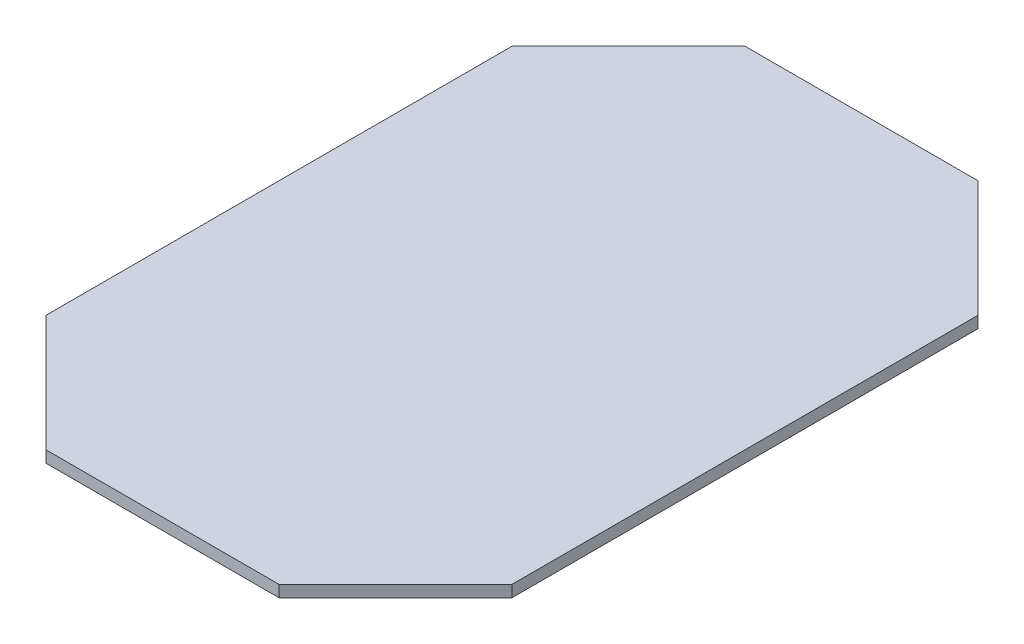
ISO-10303-21;
HEADER;
FILE_DESCRIPTION(('STEP AP214'),'2;1');
FILE_NAME('part.step','',(''),(''),'','','');
FILE_SCHEMA(('AUTOMOTIVE_DESIGN { 1 0 10303 214 1 1 1 1 }'));
ENDSEC;
DATA;
#1=APPLICATION_CONTEXT('core data for automotive mechanical design processes');
#2=APPLICATION_PROTOCOL_DEFINITION('international standard','automotive_design',2000,#1);
#3=PRODUCT_CONTEXT('',#1,'mechanical');
#4=PRODUCT('Part','Part','',(#3));
#5=PRODUCT_RELATED_PRODUCT_CATEGORY('part','',(#4));
#6=PRODUCT_DEFINITION_FORMATION('','',#4);
#7=PRODUCT_DEFINITION_CONTEXT('part definition',#1,'design');
#8=PRODUCT_DEFINITION('design','',#6,#7);
#9=PRODUCT_DEFINITION_SHAPE('','',#8);
#10=(LENGTH_UNIT() NAMED_UNIT(*) SI_UNIT(.MILLI.,.METRE.));
#11=(NAMED_UNIT(*) PLANE_ANGLE_UNIT() SI_UNIT($,.RADIAN.));
#12=(NAMED_UNIT(*) SI_UNIT($,.STERADIAN.) SOLID_ANGLE_UNIT());
#13=UNCERTAINTY_MEASURE_WITH_UNIT(LENGTH_MEASURE(1.E-05),#10,'distance_accuracy_value','');
#14=(GEOMETRIC_REPRESENTATION_CONTEXT(3) GLOBAL_UNCERTAINTY_ASSIGNED_CONTEXT((#13)) GLOBAL_UNIT_ASSIGNED_CONTEXT((#10,
#11,#12)) REPRESENTATION_CONTEXT('',''));
#15=CARTESIAN_POINT('',(0.,0.,0.));
#16=DIRECTION('',(0.,0.,1.));
#17=DIRECTION('',(1.,0.,0.));
#18=AXIS2_PLACEMENT_3D('',#15,#16,#17);
#19=CARTESIAN_POINT('',(40.,2.,0.));
#20=DIRECTION('',(1.,0.,0.));
#21=DIRECTION('',(0.,0.,-1.));
#22=AXIS2_PLACEMENT_3D('',#19,#20,#21);
#23=PLANE('',#22);
#24=DIRECTION('',(0.,0.,1.));
#25=VECTOR('',#24,1.);
#26=CARTESIAN_POINT('',(40.,0.,0.));
#27=LINE('',#26,#25);
#28=CARTESIAN_POINT('',(40.,0.,-40.));
#29=VERTEX_POINT('',#28);
#30=CARTESIAN_POINT('',(40.,0.,40.));
#31=VERTEX_POINT('',#30);
#32=EDGE_CURVE('E143',#29,#31,#27,.T.);
#33=ORIENTED_EDGE('',*,*,#32,.F.);
#34=DIRECTION('',(0.,-1.,0.));
#35=VECTOR('',#34,1.);
#36=CARTESIAN_POINT('',(40.,2.,-40.));
#37=LINE('',#36,#35);
#38=CARTESIAN_POINT('',(40.,2.,-40.));
#39=VERTEX_POINT('',#38);
#40=EDGE_CURVE('E11',#39,#29,#37,.T.);
#41=ORIENTED_EDGE('',*,*,#40,.F.);
#42=DIRECTION('',(0.,0.,1.));
#43=VECTOR('',#42,1.);
#44=CARTESIAN_POINT('',(40.,2.,0.));
#45=LINE('',#44,#43);
#46=CARTESIAN_POINT('',(40.,2.,40.));
#47=VERTEX_POINT('',#46);
#48=EDGE_CURVE('E169',#39,#47,#45,.T.);
#49=ORIENTED_EDGE('',*,*,#48,.T.);
#50=DIRECTION('',(0.,-1.,0.));
#51=VECTOR('',#50,1.);
#52=CARTESIAN_POINT('',(40.,2.,40.));
#53=LINE('',#52,#51);
#54=EDGE_CURVE('E97',#47,#31,#53,.T.);
#55=ORIENTED_EDGE('',*,*,#54,.T.);
#56=EDGE_LOOP('',(#33,#41,#49,#55));
#57=FACE_BOUND('',#56,.T.);
#58=ADVANCED_FACE('F45',(#57),#23,.T.);
#59=CARTESIAN_POINT('',(40.,2.,-40.));
#60=DIRECTION('',(0.707106781186547,0.,-0.707106781186547));
#61=DIRECTION('',(-0.707106781186548,0.,-0.707106781186548));
#62=AXIS2_PLACEMENT_3D('',#59,#60,#61);
#63=PLANE('',#62);
#64=DIRECTION('',(0.707106781186548,0.,0.707106781186548));
#65=VECTOR('',#64,1.);
#66=CARTESIAN_POINT('',(40.,0.,-40.));
#67=LINE('',#66,#65);
#68=CARTESIAN_POINT('',(20.,0.,-60.));
#69=VERTEX_POINT('',#68);
#70=EDGE_CURVE('E147',#69,#29,#67,.T.);
#71=ORIENTED_EDGE('',*,*,#70,.F.);
#72=DIRECTION('',(0.,-1.,0.));
#73=VECTOR('',#72,1.);
#74=CARTESIAN_POINT('',(20.,2.,-60.));
#75=LINE('',#74,#73);
#76=CARTESIAN_POINT('',(20.,2.,-60.));
#77=VERTEX_POINT('',#76);
#78=EDGE_CURVE('E54',#77,#69,#75,.T.);
#79=ORIENTED_EDGE('',*,*,#78,.F.);
#80=DIRECTION('',(0.707106781186548,0.,0.707106781186548));
#81=VECTOR('',#80,1.);
#82=CARTESIAN_POINT('',(40.,2.,-40.));
#83=LINE('',#82,#81);
#84=EDGE_CURVE('E201',#77,#39,#83,.T.);
#85=ORIENTED_EDGE('',*,*,#84,.T.);
#86=ORIENTED_EDGE('',*,*,#40,.T.);
#87=EDGE_LOOP('',(#71,#79,#85,#86));
#88=FACE_BOUND('',#87,.T.);
#89=ADVANCED_FACE('F192',(#88),#63,.T.);
#90=CARTESIAN_POINT('',(0.,2.,-60.));
#91=DIRECTION('',(0.,0.,-1.));
#92=DIRECTION('',(-1.,0.,0.));
#93=AXIS2_PLACEMENT_3D('',#90,#91,#92);
#94=PLANE('',#93);
#95=DIRECTION('',(1.,0.,0.));
#96=VECTOR('',#95,1.);
#97=CARTESIAN_POINT('',(0.,0.,-60.));
#98=LINE('',#97,#96);
#99=CARTESIAN_POINT('',(-20.,0.,-60.));
#100=VERTEX_POINT('',#99);
#101=EDGE_CURVE('E151',#100,#69,#98,.T.);
#102=ORIENTED_EDGE('',*,*,#101,.F.);
#103=DIRECTION('',(0.,-1.,0.));
#104=VECTOR('',#103,1.);
#105=CARTESIAN_POINT('',(-20.,2.,-60.));
#106=LINE('',#105,#104);
#107=CARTESIAN_POINT('',(-20.,2.,-60.));
#108=VERTEX_POINT('',#107);
#109=EDGE_CURVE('E179',#108,#100,#106,.T.);
#110=ORIENTED_EDGE('',*,*,#109,.F.);
#111=DIRECTION('',(1.,0.,0.));
#112=VECTOR('',#111,1.);
#113=CARTESIAN_POINT('',(0.,2.,-60.));
#114=LINE('',#113,#112);
#115=EDGE_CURVE('E188',#108,#77,#114,.T.);
#116=ORIENTED_EDGE('',*,*,#115,.T.);
#117=ORIENTED_EDGE('',*,*,#78,.T.);
#118=EDGE_LOOP('',(#102,#110,#116,#117));
#119=FACE_BOUND('',#118,.T.);
#120=ADVANCED_FACE('F186',(#119),#94,.T.);
#121=CARTESIAN_POINT('',(-40.,2.,-40.));
#122=DIRECTION('',(-0.707106781186547,0.,-0.707106781186547));
#123=DIRECTION('',(-0.707106781186548,0.,0.707106781186548));
#124=AXIS2_PLACEMENT_3D('',#121,#122,#123);
#125=PLANE('',#124);
#126=DIRECTION('',(0.707106781186548,0.,-0.707106781186548));
#127=VECTOR('',#126,1.);
#128=CARTESIAN_POINT('',(-40.,0.,-40.));
#129=LINE('',#128,#127);
#130=CARTESIAN_POINT('',(-40.,0.,-40.));
#131=VERTEX_POINT('',#130);
#132=EDGE_CURVE('E155',#131,#100,#129,.T.);
#133=ORIENTED_EDGE('',*,*,#132,.F.);
#134=DIRECTION('',(0.,-1.,0.));
#135=VECTOR('',#134,1.);
#136=CARTESIAN_POINT('',(-40.,2.,-40.));
#137=LINE('',#136,#135);
#138=CARTESIAN_POINT('',(-40.,2.,-40.));
#139=VERTEX_POINT('',#138);
#140=EDGE_CURVE('E176',#139,#131,#137,.T.);
#141=ORIENTED_EDGE('',*,*,#140,.F.);
#142=DIRECTION('',(0.707106781186548,0.,-0.707106781186548));
#143=VECTOR('',#142,1.);
#144=CARTESIAN_POINT('',(-40.,2.,-40.));
#145=LINE('',#144,#143);
#146=EDGE_CURVE('E200',#139,#108,#145,.T.);
#147=ORIENTED_EDGE('',*,*,#146,.T.);
#148=ORIENTED_EDGE('',*,*,#109,.T.);
#149=EDGE_LOOP('',(#133,#141,#147,#148));
#150=FACE_BOUND('',#149,.T.);
#151=ADVANCED_FACE('F198',(#150),#125,.T.);
#152=CARTESIAN_POINT('',(-40.,2.,0.));
#153=DIRECTION('',(1.,0.,0.));
#154=DIRECTION('',(0.,0.,-1.));
#155=AXIS2_PLACEMENT_3D('',#152,#153,#154);
#156=PLANE('',#155);
#157=DIRECTION('',(0.,0.,1.));
#158=VECTOR('',#157,1.);
#159=CARTESIAN_POINT('',(-40.,0.,0.));
#160=LINE('',#159,#158);
#161=CARTESIAN_POINT('',(-40.,0.,40.));
#162=VERTEX_POINT('',#161);
#163=EDGE_CURVE('E159',#131,#162,#160,.T.);
#164=ORIENTED_EDGE('',*,*,#163,.T.);
#165=DIRECTION('',(0.,-1.,0.));
#166=VECTOR('',#165,1.);
#167=CARTESIAN_POINT('',(-40.,2.,40.));
#168=LINE('',#167,#166);
#169=CARTESIAN_POINT('',(-40.,2.,40.));
#170=VERTEX_POINT('',#169);
#171=EDGE_CURVE('E133',#170,#162,#168,.T.);
#172=ORIENTED_EDGE('',*,*,#171,.F.);
#173=DIRECTION('',(0.,0.,1.));
#174=VECTOR('',#173,1.);
#175=CARTESIAN_POINT('',(-40.,2.,0.));
#176=LINE('',#175,#174);
#177=EDGE_CURVE('E122',#139,#170,#176,.T.);
#178=ORIENTED_EDGE('',*,*,#177,.F.);
#179=ORIENTED_EDGE('',*,*,#140,.T.);
#180=EDGE_LOOP('',(#164,#172,#178,#179));
#181=FACE_BOUND('',#180,.T.);
#182=ADVANCED_FACE('F222',(#181),#156,.F.);
#183=CARTESIAN_POINT('',(-40.,2.,40.));
#184=DIRECTION('',(0.707106781186547,0.,-0.707106781186547));
#185=DIRECTION('',(-0.707106781186548,0.,-0.707106781186548));
#186=AXIS2_PLACEMENT_3D('',#183,#184,#185);
#187=PLANE('',#186);
#188=DIRECTION('',(0.707106781186548,0.,0.707106781186548));
#189=VECTOR('',#188,1.);
#190=CARTESIAN_POINT('',(-40.,0.,40.));
#191=LINE('',#190,#189);
#192=CARTESIAN_POINT('',(-20.,0.,60.));
#193=VERTEX_POINT('',#192);
#194=EDGE_CURVE('E131',#162,#193,#191,.T.);
#195=ORIENTED_EDGE('',*,*,#194,.T.);
#196=DIRECTION('',(0.,-1.,0.));
#197=VECTOR('',#196,1.);
#198=CARTESIAN_POINT('',(-20.,2.,60.));
#199=LINE('',#198,#197);
#200=CARTESIAN_POINT('',(-20.,2.,60.));
#201=VERTEX_POINT('',#200);
#202=EDGE_CURVE('E128',#201,#193,#199,.T.);
#203=ORIENTED_EDGE('',*,*,#202,.F.);
#204=DIRECTION('',(0.707106781186548,0.,0.707106781186548));
#205=VECTOR('',#204,1.);
#206=CARTESIAN_POINT('',(-40.,2.,40.));
#207=LINE('',#206,#205);
#208=EDGE_CURVE('E115',#170,#201,#207,.T.);
#209=ORIENTED_EDGE('',*,*,#208,.F.);
#210=ORIENTED_EDGE('',*,*,#171,.T.);
#211=EDGE_LOOP('',(#195,#203,#209,#210));
#212=FACE_BOUND('',#211,.T.);
#213=ADVANCED_FACE('F129',(#212),#187,.F.);
#214=CARTESIAN_POINT('',(0.,2.,60.));
#215=DIRECTION('',(0.,0.,-1.));
#216=DIRECTION('',(-1.,0.,0.));
#217=AXIS2_PLACEMENT_3D('',#214,#215,#216);
#218=PLANE('',#217);
#219=DIRECTION('',(1.,0.,0.));
#220=VECTOR('',#219,1.);
#221=CARTESIAN_POINT('',(0.,0.,60.));
#222=LINE('',#221,#220);
#223=CARTESIAN_POINT('',(20.,0.,60.));
#224=VERTEX_POINT('',#223);
#225=EDGE_CURVE('E90',#193,#224,#222,.T.);
#226=ORIENTED_EDGE('',*,*,#225,.T.);
#227=DIRECTION('',(0.,-1.,0.));
#228=VECTOR('',#227,1.);
#229=CARTESIAN_POINT('',(20.,2.,60.));
#230=LINE('',#229,#228);
#231=CARTESIAN_POINT('',(20.,2.,60.));
#232=VERTEX_POINT('',#231);
#233=EDGE_CURVE('E134',#232,#224,#230,.T.);
#234=ORIENTED_EDGE('',*,*,#233,.F.);
#235=DIRECTION('',(1.,0.,0.));
#236=VECTOR('',#235,1.);
#237=CARTESIAN_POINT('',(0.,2.,60.));
#238=LINE('',#237,#236);
#239=EDGE_CURVE('E119',#201,#232,#238,.T.);
#240=ORIENTED_EDGE('',*,*,#239,.F.);
#241=ORIENTED_EDGE('',*,*,#202,.T.);
#242=EDGE_LOOP('',(#226,#234,#240,#241));
#243=FACE_BOUND('',#242,.T.);
#244=ADVANCED_FACE('F136',(#243),#218,.F.);
#245=CARTESIAN_POINT('',(40.,2.,40.));
#246=DIRECTION('',(-0.707106781186547,0.,-0.707106781186547));
#247=DIRECTION('',(-0.707106781186548,0.,0.707106781186548));
#248=AXIS2_PLACEMENT_3D('',#245,#246,#247);
#249=PLANE('',#248);
#250=DIRECTION('',(0.707106781186548,0.,-0.707106781186548));
#251=VECTOR('',#250,1.);
#252=CARTESIAN_POINT('',(40.,0.,40.));
#253=LINE('',#252,#251);
#254=EDGE_CURVE('E166',#224,#31,#253,.T.);
#255=ORIENTED_EDGE('',*,*,#254,.T.);
#256=ORIENTED_EDGE('',*,*,#54,.F.);
#257=DIRECTION('',(0.707106781186548,0.,-0.707106781186548));
#258=VECTOR('',#257,1.);
#259=CARTESIAN_POINT('',(40.,2.,40.));
#260=LINE('',#259,#258);
#261=EDGE_CURVE('E62',#232,#47,#260,.T.);
#262=ORIENTED_EDGE('',*,*,#261,.F.);
#263=ORIENTED_EDGE('',*,*,#233,.T.);
#264=EDGE_LOOP('',(#255,#256,#262,#263));
#265=FACE_BOUND('',#264,.T.);
#266=ADVANCED_FACE('F230',(#265),#249,.F.);
#267=CARTESIAN_POINT('',(0.,2.,0.));
#268=DIRECTION('',(0.,1.,0.));
#269=DIRECTION('',(0.,0.,1.));
#270=AXIS2_PLACEMENT_3D('',#267,#268,#269);
#271=PLANE('',#270);
#272=ORIENTED_EDGE('',*,*,#48,.F.);
#273=ORIENTED_EDGE('',*,*,#84,.F.);
#274=ORIENTED_EDGE('',*,*,#115,.F.);
#275=ORIENTED_EDGE('',*,*,#146,.F.);
#276=ORIENTED_EDGE('',*,*,#177,.T.);
#277=ORIENTED_EDGE('',*,*,#208,.T.);
#278=ORIENTED_EDGE('',*,*,#239,.T.);
#279=ORIENTED_EDGE('',*,*,#261,.T.);
#280=EDGE_LOOP('',(#272,#273,#274,#275,#276,#277,#278,#279));
#281=FACE_BOUND('',#280,.T.);
#282=ADVANCED_FACE('F117',(#281),#271,.T.);
#283=CARTESIAN_POINT('',(0.,0.,0.));
#284=DIRECTION('',(0.,1.,0.));
#285=DIRECTION('',(0.,0.,1.));
#286=AXIS2_PLACEMENT_3D('',#283,#284,#285);
#287=PLANE('',#286);
#288=ORIENTED_EDGE('',*,*,#32,.T.);
#289=ORIENTED_EDGE('',*,*,#254,.F.);
#290=ORIENTED_EDGE('',*,*,#225,.F.);
#291=ORIENTED_EDGE('',*,*,#194,.F.);
#292=ORIENTED_EDGE('',*,*,#163,.F.);
#293=ORIENTED_EDGE('',*,*,#132,.T.);
#294=ORIENTED_EDGE('',*,*,#101,.T.);
#295=ORIENTED_EDGE('',*,*,#70,.T.);
#296=EDGE_LOOP('',(#288,#289,#290,#291,#292,#293,#294,#295));
#297=FACE_BOUND('',#296,.T.);
#298=ADVANCED_FACE('F194',(#297),#287,.F.);
#299=CLOSED_SHELL('',(#58,#89,#120,#151,#182,#213,#244,#266,#282,#298));
#300=MANIFOLD_SOLID_BREP('B2',#299);
#301=ADVANCED_BREP_SHAPE_REPRESENTATION('',(#18,#300),#14);
#302=SHAPE_DEFINITION_REPRESENTATION(#9,#301);
ENDSEC;
END-ISO-10303-21;
